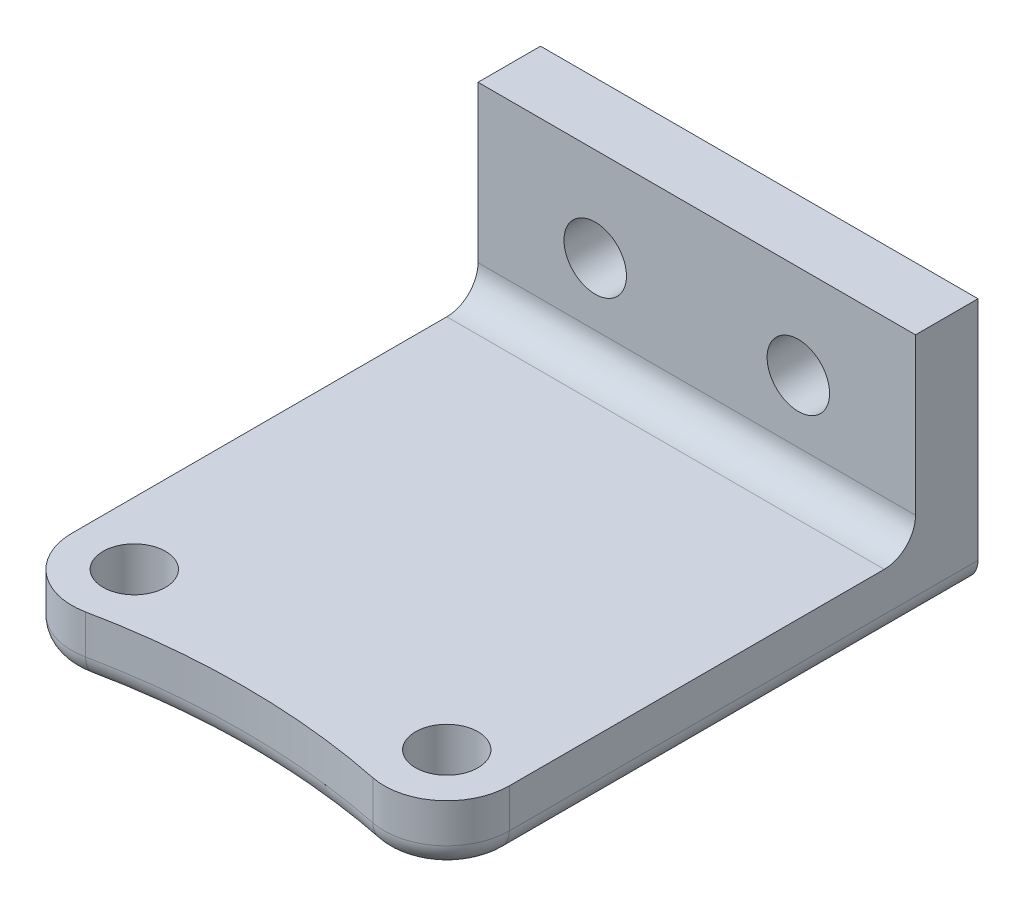
ISO-10303-21;
HEADER;
FILE_DESCRIPTION(('STEP AP214'),'2;1');
FILE_NAME('part.step','',(''),(''),'','','');
FILE_SCHEMA(('AUTOMOTIVE_DESIGN { 1 0 10303 214 1 1 1 1 }'));
ENDSEC;
DATA;
#1=APPLICATION_CONTEXT('core data for automotive mechanical design processes');
#2=APPLICATION_PROTOCOL_DEFINITION('international standard','automotive_design',2000,#1);
#3=PRODUCT_CONTEXT('',#1,'mechanical');
#4=PRODUCT('Part','Part','',(#3));
#5=PRODUCT_RELATED_PRODUCT_CATEGORY('part','',(#4));
#6=PRODUCT_DEFINITION_FORMATION('','',#4);
#7=PRODUCT_DEFINITION_CONTEXT('part definition',#1,'design');
#8=PRODUCT_DEFINITION('design','',#6,#7);
#9=PRODUCT_DEFINITION_SHAPE('','',#8);
#10=(LENGTH_UNIT() NAMED_UNIT(*) SI_UNIT(.MILLI.,.METRE.));
#11=(NAMED_UNIT(*) PLANE_ANGLE_UNIT() SI_UNIT($,.RADIAN.));
#12=(NAMED_UNIT(*) SI_UNIT($,.STERADIAN.) SOLID_ANGLE_UNIT());
#13=UNCERTAINTY_MEASURE_WITH_UNIT(LENGTH_MEASURE(1.E-05),#10,'distance_accuracy_value','');
#14=(GEOMETRIC_REPRESENTATION_CONTEXT(3) GLOBAL_UNCERTAINTY_ASSIGNED_CONTEXT((#13)) GLOBAL_UNIT_ASSIGNED_CONTEXT((#10,
#11,#12)) REPRESENTATION_CONTEXT('',''));
#15=CARTESIAN_POINT('',(0.,0.,0.));
#16=DIRECTION('',(0.,0.,1.));
#17=DIRECTION('',(1.,0.,0.));
#18=AXIS2_PLACEMENT_3D('',#15,#16,#17);
#19=CARTESIAN_POINT('',(10.,4.,48.7662963080753));
#20=DIRECTION('',(0.,1.,0.));
#21=DIRECTION('',(0.,0.,1.));
#22=AXIS2_PLACEMENT_3D('',#19,#20,#21);
#23=PLANE('',#22);
#24=DIRECTION('',(0.,0.,-1.));
#25=VECTOR('',#24,1.);
#26=CARTESIAN_POINT('',(24.,4.,-30.));
#27=LINE('',#26,#25);
#28=CARTESIAN_POINT('',(24.,4.,0.));
#29=VERTEX_POINT('',#28);
#30=CARTESIAN_POINT('',(24.,4.,-24.));
#31=VERTEX_POINT('',#30);
#32=EDGE_CURVE('E182',#29,#31,#27,.T.);
#33=ORIENTED_EDGE('',*,*,#32,.T.);
#34=DIRECTION('',(1.,0.,0.));
#35=VECTOR('',#34,1.);
#36=CARTESIAN_POINT('',(10.,4.,-24.));
#37=LINE('',#36,#35);
#38=CARTESIAN_POINT('',(-4.,4.,-24.));
#39=VERTEX_POINT('',#38);
#40=EDGE_CURVE('E56',#31,#39,#37,.F.);
#41=ORIENTED_EDGE('',*,*,#40,.T.);
#42=DIRECTION('',(0.,0.,1.));
#43=VECTOR('',#42,1.);
#44=CARTESIAN_POINT('',(-4.,4.,0.));
#45=LINE('',#44,#43);
#46=CARTESIAN_POINT('',(-4.,4.,0.));
#47=VERTEX_POINT('',#46);
#48=EDGE_CURVE('E184',#39,#47,#45,.T.);
#49=ORIENTED_EDGE('',*,*,#48,.T.);
#50=CARTESIAN_POINT('',(0.,4.,0.));
#51=DIRECTION('',(0.,1.,0.));
#52=DIRECTION('',(0.,0.,1.));
#53=AXIS2_PLACEMENT_3D('',#50,#51,#52);
#54=CIRCLE('',#53,4.);
#55=CARTESIAN_POINT('',(0.803518816065331,4.,3.91846366733558));
#56=VERTEX_POINT('',#55);
#57=EDGE_CURVE('E186',#47,#56,#54,.T.);
#58=ORIENTED_EDGE('',*,*,#57,.T.);
#59=CARTESIAN_POINT('',(10.,4.,48.7662963080753));
#60=DIRECTION('',(0.,-1.,0.));
#61=DIRECTION('',(0.,0.,1.));
#62=AXIS2_PLACEMENT_3D('',#59,#60,#61);
#63=CIRCLE('',#62,45.7810371085918);
#64=CARTESIAN_POINT('',(19.1964811839347,4.,3.91846366733558));
#65=VERTEX_POINT('',#64);
#66=EDGE_CURVE('E177',#56,#65,#63,.T.);
#67=ORIENTED_EDGE('',*,*,#66,.T.);
#68=CARTESIAN_POINT('',(20.,4.,0.));
#69=DIRECTION('',(0.,1.,0.));
#70=DIRECTION('',(0.,0.,1.));
#71=AXIS2_PLACEMENT_3D('',#68,#69,#70);
#72=CIRCLE('',#71,4.);
#73=EDGE_CURVE('E180',#65,#29,#72,.T.);
#74=ORIENTED_EDGE('',*,*,#73,.T.);
#75=EDGE_LOOP('',(#33,#41,#49,#58,#67,#74));
#76=FACE_BOUND('',#75,.T.);
#77=CARTESIAN_POINT('',(0.,4.,0.));
#78=DIRECTION('',(0.,1.,0.));
#79=DIRECTION('',(0.,0.,1.));
#80=AXIS2_PLACEMENT_3D('',#77,#78,#79);
#81=CIRCLE('',#80,2.);
#82=CARTESIAN_POINT('',(0.,4.,2.));
#83=VERTEX_POINT('',#82);
#84=EDGE_CURVE('E171',#83,#83,#81,.T.);
#85=ORIENTED_EDGE('',*,*,#84,.F.);
#86=EDGE_LOOP('',(#85));
#87=FACE_BOUND('',#86,.T.);
#88=CARTESIAN_POINT('',(20.,4.,0.));
#89=DIRECTION('',(0.,1.,0.));
#90=DIRECTION('',(0.,0.,1.));
#91=AXIS2_PLACEMENT_3D('',#88,#89,#90);
#92=CIRCLE('',#91,2.);
#93=CARTESIAN_POINT('',(20.,4.,2.));
#94=VERTEX_POINT('',#93);
#95=EDGE_CURVE('E165',#94,#94,#92,.T.);
#96=ORIENTED_EDGE('',*,*,#95,.F.);
#97=EDGE_LOOP('',(#96));
#98=FACE_BOUND('',#97,.T.);
#99=ADVANCED_FACE('F35',(#76,#87,#98),#23,.T.);
#100=CARTESIAN_POINT('',(10.,0.,48.7662963080753));
#101=DIRECTION('',(0.,1.,0.));
#102=DIRECTION('',(0.,0.,1.));
#103=AXIS2_PLACEMENT_3D('',#100,#101,#102);
#104=PLANE('',#103);
#105=DIRECTION('',(-1.,0.,0.));
#106=VECTOR('',#105,1.);
#107=CARTESIAN_POINT('',(-4.,0.,-30.));
#108=LINE('',#107,#106);
#109=CARTESIAN_POINT('',(22.5,0.,-30.));
#110=VERTEX_POINT('',#109);
#111=CARTESIAN_POINT('',(-2.5,0.,-30.));
#112=VERTEX_POINT('',#111);
#113=EDGE_CURVE('E174',#110,#112,#108,.T.);
#114=ORIENTED_EDGE('',*,*,#113,.F.);
#115=DIRECTION('',(0.,0.,-1.));
#116=VECTOR('',#115,1.);
#117=CARTESIAN_POINT('',(22.5,0.,48.7662963080753));
#118=LINE('',#117,#116);
#119=CARTESIAN_POINT('',(22.5,0.,0.));
#120=VERTEX_POINT('',#119);
#121=EDGE_CURVE('E215',#110,#120,#118,.F.);
#122=ORIENTED_EDGE('',*,*,#121,.T.);
#123=CARTESIAN_POINT('',(20.,0.,0.));
#124=DIRECTION('',(0.,1.,0.));
#125=DIRECTION('',(0.,0.,1.));
#126=AXIS2_PLACEMENT_3D('',#123,#124,#125);
#127=CIRCLE('',#126,2.5);
#128=CARTESIAN_POINT('',(19.4978007399592,0.,2.44903979208473));
#129=VERTEX_POINT('',#128);
#130=EDGE_CURVE('E213',#120,#129,#127,.F.);
#131=ORIENTED_EDGE('',*,*,#130,.T.);
#132=CARTESIAN_POINT('',(10.,0.,48.7662963080753));
#133=DIRECTION('',(0.,1.,0.));
#134=DIRECTION('',(0.,0.,1.));
#135=AXIS2_PLACEMENT_3D('',#132,#133,#134);
#136=CIRCLE('',#135,47.2810371085918);
#137=CARTESIAN_POINT('',(0.502199260040832,0.,2.44903979208473));
#138=VERTEX_POINT('',#137);
#139=EDGE_CURVE('E211',#129,#138,#136,.T.);
#140=ORIENTED_EDGE('',*,*,#139,.T.);
#141=CARTESIAN_POINT('',(0.,0.,0.));
#142=DIRECTION('',(0.,1.,0.));
#143=DIRECTION('',(0.,0.,1.));
#144=AXIS2_PLACEMENT_3D('',#141,#142,#143);
#145=CIRCLE('',#144,2.5);
#146=CARTESIAN_POINT('',(-2.5,0.,0.));
#147=VERTEX_POINT('',#146);
#148=EDGE_CURVE('E209',#138,#147,#145,.F.);
#149=ORIENTED_EDGE('',*,*,#148,.T.);
#150=DIRECTION('',(0.,0.,1.));
#151=VECTOR('',#150,1.);
#152=CARTESIAN_POINT('',(-2.5,0.,48.7662963080753));
#153=LINE('',#152,#151);
#154=EDGE_CURVE('E207',#147,#112,#153,.F.);
#155=ORIENTED_EDGE('',*,*,#154,.T.);
#156=EDGE_LOOP('',(#114,#122,#131,#140,#149,#155));
#157=FACE_BOUND('',#156,.T.);
#158=CARTESIAN_POINT('',(0.,0.,0.));
#159=DIRECTION('',(0.,1.,0.));
#160=DIRECTION('',(0.,0.,1.));
#161=AXIS2_PLACEMENT_3D('',#158,#159,#160);
#162=CIRCLE('',#161,2.);
#163=CARTESIAN_POINT('',(0.,0.,2.));
#164=VERTEX_POINT('',#163);
#165=EDGE_CURVE('E168',#164,#164,#162,.T.);
#166=ORIENTED_EDGE('',*,*,#165,.T.);
#167=EDGE_LOOP('',(#166));
#168=FACE_BOUND('',#167,.T.);
#169=CARTESIAN_POINT('',(20.,0.,0.));
#170=DIRECTION('',(0.,1.,0.));
#171=DIRECTION('',(0.,0.,1.));
#172=AXIS2_PLACEMENT_3D('',#169,#170,#171);
#173=CIRCLE('',#172,2.);
#174=CARTESIAN_POINT('',(20.,0.,2.));
#175=VERTEX_POINT('',#174);
#176=EDGE_CURVE('E164',#175,#175,#173,.T.);
#177=ORIENTED_EDGE('',*,*,#176,.T.);
#178=EDGE_LOOP('',(#177));
#179=FACE_BOUND('',#178,.T.);
#180=ADVANCED_FACE('F253',(#157,#168,#179),#104,.F.);
#181=CARTESIAN_POINT('',(10.,4.,48.7662963080753));
#182=DIRECTION('',(0.,-1.,0.));
#183=DIRECTION('',(0.,0.,-1.));
#184=AXIS2_PLACEMENT_3D('',#181,#182,#183);
#185=CYLINDRICAL_SURFACE('',#184,45.7810371085918);
#186=DIRECTION('',(0.,-1.,0.));
#187=VECTOR('',#186,1.);
#188=CARTESIAN_POINT('',(0.803518816065331,4.,3.91846366733558));
#189=LINE('',#188,#187);
#190=CARTESIAN_POINT('',(0.803518816065331,1.5,3.91846366733558));
#191=VERTEX_POINT('',#190);
#192=EDGE_CURVE('E188',#56,#191,#189,.T.);
#193=ORIENTED_EDGE('',*,*,#192,.T.);
#194=CARTESIAN_POINT('',(10.,1.5,48.7662963080753));
#195=DIRECTION('',(0.,1.,0.));
#196=DIRECTION('',(0.,0.,1.));
#197=AXIS2_PLACEMENT_3D('',#194,#195,#196);
#198=CIRCLE('',#197,45.7810371085918);
#199=CARTESIAN_POINT('',(19.1964811839347,1.5,3.91846366733558));
#200=VERTEX_POINT('',#199);
#201=EDGE_CURVE('E219',#191,#200,#198,.F.);
#202=ORIENTED_EDGE('',*,*,#201,.T.);
#203=DIRECTION('',(0.,-1.,0.));
#204=VECTOR('',#203,1.);
#205=CARTESIAN_POINT('',(19.1964811839347,4.,3.91846366733558));
#206=LINE('',#205,#204);
#207=EDGE_CURVE('E198',#65,#200,#206,.T.);
#208=ORIENTED_EDGE('',*,*,#207,.F.);
#209=ORIENTED_EDGE('',*,*,#66,.F.);
#210=EDGE_LOOP('',(#193,#202,#208,#209));
#211=FACE_BOUND('',#210,.T.);
#212=ADVANCED_FACE('F293',(#211),#185,.F.);
#213=CARTESIAN_POINT('',(20.,4.,0.));
#214=DIRECTION('',(0.,-1.,0.));
#215=DIRECTION('',(0.,0.,-1.));
#216=AXIS2_PLACEMENT_3D('',#213,#214,#215);
#217=CYLINDRICAL_SURFACE('',#216,4.);
#218=ORIENTED_EDGE('',*,*,#207,.T.);
#219=CARTESIAN_POINT('',(20.,1.5,0.));
#220=DIRECTION('',(0.,1.,0.));
#221=DIRECTION('',(0.,0.,1.));
#222=AXIS2_PLACEMENT_3D('',#219,#220,#221);
#223=CIRCLE('',#222,4.);
#224=CARTESIAN_POINT('',(24.,1.5,0.));
#225=VERTEX_POINT('',#224);
#226=EDGE_CURVE('E217',#200,#225,#223,.T.);
#227=ORIENTED_EDGE('',*,*,#226,.T.);
#228=DIRECTION('',(0.,-1.,0.));
#229=VECTOR('',#228,1.);
#230=CARTESIAN_POINT('',(24.,4.,0.));
#231=LINE('',#230,#229);
#232=EDGE_CURVE('E195',#29,#225,#231,.T.);
#233=ORIENTED_EDGE('',*,*,#232,.F.);
#234=ORIENTED_EDGE('',*,*,#73,.F.);
#235=EDGE_LOOP('',(#218,#227,#233,#234));
#236=FACE_BOUND('',#235,.T.);
#237=ADVANCED_FACE('F308',(#236),#217,.T.);
#238=CARTESIAN_POINT('',(24.,4.,-30.));
#239=DIRECTION('',(-1.,0.,0.));
#240=DIRECTION('',(0.,0.,1.));
#241=AXIS2_PLACEMENT_3D('',#238,#239,#240);
#242=PLANE('',#241);
#243=ORIENTED_EDGE('',*,*,#232,.T.);
#244=DIRECTION('',(0.,0.,-1.));
#245=VECTOR('',#244,1.);
#246=CARTESIAN_POINT('',(24.,1.5,-30.));
#247=LINE('',#246,#245);
#248=CARTESIAN_POINT('',(24.,1.5,-30.));
#249=VERTEX_POINT('',#248);
#250=EDGE_CURVE('E201',#225,#249,#247,.T.);
#251=ORIENTED_EDGE('',*,*,#250,.T.);
#252=DIRECTION('',(0.,-1.,0.));
#253=VECTOR('',#252,1.);
#254=CARTESIAN_POINT('',(24.,4.,-30.));
#255=LINE('',#254,#253);
#256=CARTESIAN_POINT('',(24.,16.,-30.));
#257=VERTEX_POINT('',#256);
#258=EDGE_CURVE('E134',#257,#249,#255,.T.);
#259=ORIENTED_EDGE('',*,*,#258,.F.);
#260=DIRECTION('',(0.,0.,-1.));
#261=VECTOR('',#260,1.);
#262=CARTESIAN_POINT('',(24.,16.,-26.));
#263=LINE('',#262,#261);
#264=CARTESIAN_POINT('',(24.,16.,-26.));
#265=VERTEX_POINT('',#264);
#266=EDGE_CURVE('E149',#265,#257,#263,.T.);
#267=ORIENTED_EDGE('',*,*,#266,.F.);
#268=DIRECTION('',(0.,-1.,0.));
#269=VECTOR('',#268,1.);
#270=CARTESIAN_POINT('',(24.,16.,-26.));
#271=LINE('',#270,#269);
#272=CARTESIAN_POINT('',(24.,6.,-26.));
#273=VERTEX_POINT('',#272);
#274=EDGE_CURVE('E161',#265,#273,#271,.T.);
#275=ORIENTED_EDGE('',*,*,#274,.T.);
#276=CARTESIAN_POINT('',(24.,6.,-24.));
#277=DIRECTION('',(-1.,0.,0.));
#278=DIRECTION('',(0.,0.,1.));
#279=AXIS2_PLACEMENT_3D('',#276,#277,#278);
#280=CIRCLE('',#279,2.);
#281=EDGE_CURVE('E43',#273,#31,#280,.T.);
#282=ORIENTED_EDGE('',*,*,#281,.T.);
#283=ORIENTED_EDGE('',*,*,#32,.F.);
#284=EDGE_LOOP('',(#243,#251,#259,#267,#275,#282,#283));
#285=FACE_BOUND('',#284,.T.);
#286=ADVANCED_FACE('F247',(#285),#242,.F.);
#287=CARTESIAN_POINT('',(-4.,4.,-30.));
#288=DIRECTION('',(0.,0.,1.));
#289=DIRECTION('',(1.,0.,0.));
#290=AXIS2_PLACEMENT_3D('',#287,#288,#289);
#291=PLANE('',#290);
#292=CARTESIAN_POINT('',(3.5,10.,-30.));
#293=DIRECTION('',(0.,0.,1.));
#294=DIRECTION('',(1.,0.,0.));
#295=AXIS2_PLACEMENT_3D('',#292,#293,#294);
#296=CIRCLE('',#295,2.);
#297=CARTESIAN_POINT('',(5.5,10.,-30.));
#298=VERTEX_POINT('',#297);
#299=EDGE_CURVE('E150',#298,#298,#296,.F.);
#300=ORIENTED_EDGE('',*,*,#299,.F.);
#301=EDGE_LOOP('',(#300));
#302=FACE_BOUND('',#301,.T.);
#303=CARTESIAN_POINT('',(16.5,10.,-30.));
#304=DIRECTION('',(0.,0.,1.));
#305=DIRECTION('',(1.,0.,0.));
#306=AXIS2_PLACEMENT_3D('',#303,#304,#305);
#307=CIRCLE('',#306,2.);
#308=CARTESIAN_POINT('',(18.5,10.,-30.));
#309=VERTEX_POINT('',#308);
#310=EDGE_CURVE('E156',#309,#309,#307,.F.);
#311=ORIENTED_EDGE('',*,*,#310,.F.);
#312=EDGE_LOOP('',(#311));
#313=FACE_BOUND('',#312,.T.);
#314=ORIENTED_EDGE('',*,*,#258,.T.);
#315=CARTESIAN_POINT('',(22.5,1.5,-30.));
#316=DIRECTION('',(0.,0.,1.));
#317=DIRECTION('',(1.,0.,0.));
#318=AXIS2_PLACEMENT_3D('',#315,#316,#317);
#319=CIRCLE('',#318,1.5);
#320=EDGE_CURVE('E205',#249,#110,#319,.F.);
#321=ORIENTED_EDGE('',*,*,#320,.T.);
#322=ORIENTED_EDGE('',*,*,#113,.T.);
#323=CARTESIAN_POINT('',(-2.5,1.5,-30.));
#324=DIRECTION('',(0.,0.,1.));
#325=DIRECTION('',(1.,0.,0.));
#326=AXIS2_PLACEMENT_3D('',#323,#324,#325);
#327=CIRCLE('',#326,1.5);
#328=CARTESIAN_POINT('',(-4.,1.5,-30.));
#329=VERTEX_POINT('',#328);
#330=EDGE_CURVE('E131',#112,#329,#327,.F.);
#331=ORIENTED_EDGE('',*,*,#330,.T.);
#332=DIRECTION('',(0.,-1.,0.));
#333=VECTOR('',#332,1.);
#334=CARTESIAN_POINT('',(-4.,4.,-30.));
#335=LINE('',#334,#333);
#336=CARTESIAN_POINT('',(-4.,16.,-30.));
#337=VERTEX_POINT('',#336);
#338=EDGE_CURVE('E123',#337,#329,#335,.T.);
#339=ORIENTED_EDGE('',*,*,#338,.F.);
#340=DIRECTION('',(-1.,0.,0.));
#341=VECTOR('',#340,1.);
#342=CARTESIAN_POINT('',(24.,16.,-30.));
#343=LINE('',#342,#341);
#344=EDGE_CURVE('E128',#257,#337,#343,.T.);
#345=ORIENTED_EDGE('',*,*,#344,.F.);
#346=EDGE_LOOP('',(#314,#321,#322,#331,#339,#345));
#347=FACE_BOUND('',#346,.T.);
#348=ADVANCED_FACE('F126',(#302,#313,#347),#291,.F.);
#349=CARTESIAN_POINT('',(-4.,4.,0.));
#350=DIRECTION('',(1.,0.,0.));
#351=DIRECTION('',(0.,0.,-1.));
#352=AXIS2_PLACEMENT_3D('',#349,#350,#351);
#353=PLANE('',#352);
#354=ORIENTED_EDGE('',*,*,#338,.T.);
#355=DIRECTION('',(0.,0.,1.));
#356=VECTOR('',#355,1.);
#357=CARTESIAN_POINT('',(-4.,1.5,0.));
#358=LINE('',#357,#356);
#359=CARTESIAN_POINT('',(-4.,1.5,0.));
#360=VERTEX_POINT('',#359);
#361=EDGE_CURVE('E223',#329,#360,#358,.T.);
#362=ORIENTED_EDGE('',*,*,#361,.T.);
#363=DIRECTION('',(0.,-1.,0.));
#364=VECTOR('',#363,1.);
#365=CARTESIAN_POINT('',(-4.,4.,0.));
#366=LINE('',#365,#364);
#367=EDGE_CURVE('E135',#47,#360,#366,.T.);
#368=ORIENTED_EDGE('',*,*,#367,.F.);
#369=ORIENTED_EDGE('',*,*,#48,.F.);
#370=CARTESIAN_POINT('',(-4.,6.,-24.));
#371=DIRECTION('',(1.,0.,0.));
#372=DIRECTION('',(0.,0.,-1.));
#373=AXIS2_PLACEMENT_3D('',#370,#371,#372);
#374=CIRCLE('',#373,2.);
#375=CARTESIAN_POINT('',(-4.,6.,-26.));
#376=VERTEX_POINT('',#375);
#377=EDGE_CURVE('E11',#39,#376,#374,.T.);
#378=ORIENTED_EDGE('',*,*,#377,.T.);
#379=DIRECTION('',(0.,-1.,0.));
#380=VECTOR('',#379,1.);
#381=CARTESIAN_POINT('',(-4.,16.,-26.));
#382=LINE('',#381,#380);
#383=CARTESIAN_POINT('',(-4.,16.,-26.));
#384=VERTEX_POINT('',#383);
#385=EDGE_CURVE('E141',#384,#376,#382,.T.);
#386=ORIENTED_EDGE('',*,*,#385,.F.);
#387=DIRECTION('',(0.,0.,1.));
#388=VECTOR('',#387,1.);
#389=CARTESIAN_POINT('',(-4.,16.,-30.));
#390=LINE('',#389,#388);
#391=EDGE_CURVE('E138',#337,#384,#390,.T.);
#392=ORIENTED_EDGE('',*,*,#391,.F.);
#393=EDGE_LOOP('',(#354,#362,#368,#369,#378,#386,#392));
#394=FACE_BOUND('',#393,.T.);
#395=ADVANCED_FACE('F139',(#394),#353,.F.);
#396=CARTESIAN_POINT('',(0.,4.,0.));
#397=DIRECTION('',(0.,-1.,0.));
#398=DIRECTION('',(0.,0.,-1.));
#399=AXIS2_PLACEMENT_3D('',#396,#397,#398);
#400=CYLINDRICAL_SURFACE('',#399,4.);
#401=ORIENTED_EDGE('',*,*,#367,.T.);
#402=CARTESIAN_POINT('',(0.,1.5,0.));
#403=DIRECTION('',(0.,1.,0.));
#404=DIRECTION('',(0.,0.,1.));
#405=AXIS2_PLACEMENT_3D('',#402,#403,#404);
#406=CIRCLE('',#405,4.);
#407=EDGE_CURVE('E221',#360,#191,#406,.T.);
#408=ORIENTED_EDGE('',*,*,#407,.T.);
#409=ORIENTED_EDGE('',*,*,#192,.F.);
#410=ORIENTED_EDGE('',*,*,#57,.F.);
#411=EDGE_LOOP('',(#401,#408,#409,#410));
#412=FACE_BOUND('',#411,.T.);
#413=ADVANCED_FACE('F278',(#412),#400,.T.);
#414=CARTESIAN_POINT('',(0.,4.,0.));
#415=DIRECTION('',(0.,-1.,0.));
#416=DIRECTION('',(0.,0.,-1.));
#417=AXIS2_PLACEMENT_3D('',#414,#415,#416);
#418=CYLINDRICAL_SURFACE('',#417,2.);
#419=ORIENTED_EDGE('',*,*,#84,.T.);
#420=EDGE_LOOP('',(#419));
#421=FACE_BOUND('',#420,.T.);
#422=ORIENTED_EDGE('',*,*,#165,.F.);
#423=EDGE_LOOP('',(#422));
#424=FACE_BOUND('',#423,.T.);
#425=ADVANCED_FACE('F296',(#421,#424),#418,.F.);
#426=CARTESIAN_POINT('',(20.,4.,0.));
#427=DIRECTION('',(0.,-1.,0.));
#428=DIRECTION('',(0.,0.,-1.));
#429=AXIS2_PLACEMENT_3D('',#426,#427,#428);
#430=CYLINDRICAL_SURFACE('',#429,2.);
#431=ORIENTED_EDGE('',*,*,#95,.T.);
#432=EDGE_LOOP('',(#431));
#433=FACE_BOUND('',#432,.T.);
#434=ORIENTED_EDGE('',*,*,#176,.F.);
#435=EDGE_LOOP('',(#434));
#436=FACE_BOUND('',#435,.T.);
#437=ADVANCED_FACE('F338',(#433,#436),#430,.F.);
#438=CARTESIAN_POINT('',(-4.,16.,-26.));
#439=DIRECTION('',(0.,0.,-1.));
#440=DIRECTION('',(-1.,0.,0.));
#441=AXIS2_PLACEMENT_3D('',#438,#439,#440);
#442=PLANE('',#441);
#443=CARTESIAN_POINT('',(3.5,10.,-26.));
#444=DIRECTION('',(0.,0.,1.));
#445=DIRECTION('',(1.,0.,0.));
#446=AXIS2_PLACEMENT_3D('',#443,#444,#445);
#447=CIRCLE('',#446,2.);
#448=CARTESIAN_POINT('',(5.5,10.,-26.));
#449=VERTEX_POINT('',#448);
#450=EDGE_CURVE('E153',#449,#449,#447,.T.);
#451=ORIENTED_EDGE('',*,*,#450,.F.);
#452=EDGE_LOOP('',(#451));
#453=FACE_BOUND('',#452,.T.);
#454=CARTESIAN_POINT('',(16.5,10.,-26.));
#455=DIRECTION('',(0.,0.,1.));
#456=DIRECTION('',(1.,0.,0.));
#457=AXIS2_PLACEMENT_3D('',#454,#455,#456);
#458=CIRCLE('',#457,2.);
#459=CARTESIAN_POINT('',(18.5,10.,-26.));
#460=VERTEX_POINT('',#459);
#461=EDGE_CURVE('E238',#460,#460,#458,.T.);
#462=ORIENTED_EDGE('',*,*,#461,.F.);
#463=EDGE_LOOP('',(#462));
#464=FACE_BOUND('',#463,.T.);
#465=ORIENTED_EDGE('',*,*,#385,.T.);
#466=DIRECTION('',(1.,0.,0.));
#467=VECTOR('',#466,1.);
#468=CARTESIAN_POINT('',(-4.,6.,-26.));
#469=LINE('',#468,#467);
#470=EDGE_CURVE('E225',#376,#273,#469,.T.);
#471=ORIENTED_EDGE('',*,*,#470,.T.);
#472=ORIENTED_EDGE('',*,*,#274,.F.);
#473=DIRECTION('',(1.,0.,0.));
#474=VECTOR('',#473,1.);
#475=CARTESIAN_POINT('',(-4.,16.,-26.));
#476=LINE('',#475,#474);
#477=EDGE_CURVE('E144',#384,#265,#476,.T.);
#478=ORIENTED_EDGE('',*,*,#477,.F.);
#479=EDGE_LOOP('',(#465,#471,#472,#478));
#480=FACE_BOUND('',#479,.T.);
#481=ADVANCED_FACE('F244',(#453,#464,#480),#442,.F.);
#482=CARTESIAN_POINT('',(0.,16.,0.));
#483=DIRECTION('',(0.,1.,0.));
#484=DIRECTION('',(0.,0.,1.));
#485=AXIS2_PLACEMENT_3D('',#482,#483,#484);
#486=PLANE('',#485);
#487=ORIENTED_EDGE('',*,*,#344,.T.);
#488=ORIENTED_EDGE('',*,*,#391,.T.);
#489=ORIENTED_EDGE('',*,*,#477,.T.);
#490=ORIENTED_EDGE('',*,*,#266,.T.);
#491=EDGE_LOOP('',(#487,#488,#489,#490));
#492=FACE_BOUND('',#491,.T.);
#493=ADVANCED_FACE('F147',(#492),#486,.T.);
#494=CARTESIAN_POINT('',(16.5,10.,-35.6568542494924));
#495=DIRECTION('',(0.,0.,1.));
#496=DIRECTION('',(1.,0.,0.));
#497=AXIS2_PLACEMENT_3D('',#494,#495,#496);
#498=CYLINDRICAL_SURFACE('',#497,2.);
#499=ORIENTED_EDGE('',*,*,#310,.T.);
#500=EDGE_LOOP('',(#499));
#501=FACE_BOUND('',#500,.T.);
#502=ORIENTED_EDGE('',*,*,#461,.T.);
#503=EDGE_LOOP('',(#502));
#504=FACE_BOUND('',#503,.T.);
#505=ADVANCED_FACE('F325',(#501,#504),#498,.F.);
#506=CARTESIAN_POINT('',(3.5,10.,-35.6568542494924));
#507=DIRECTION('',(0.,0.,1.));
#508=DIRECTION('',(1.,0.,0.));
#509=AXIS2_PLACEMENT_3D('',#506,#507,#508);
#510=CYLINDRICAL_SURFACE('',#509,2.);
#511=ORIENTED_EDGE('',*,*,#299,.T.);
#512=EDGE_LOOP('',(#511));
#513=FACE_BOUND('',#512,.T.);
#514=ORIENTED_EDGE('',*,*,#450,.T.);
#515=EDGE_LOOP('',(#514));
#516=FACE_BOUND('',#515,.T.);
#517=ADVANCED_FACE('F321',(#513,#516),#510,.F.);
#518=CARTESIAN_POINT('',(-2.5,1.5,0.));
#519=DIRECTION('',(0.,0.,1.));
#520=DIRECTION('',(1.,0.,0.));
#521=AXIS2_PLACEMENT_3D('',#518,#519,#520);
#522=CYLINDRICAL_SURFACE('',#521,1.5);
#523=ORIENTED_EDGE('',*,*,#330,.F.);
#524=ORIENTED_EDGE('',*,*,#154,.F.);
#525=CARTESIAN_POINT('',(-2.5,1.5,0.));
#526=DIRECTION('',(0.,0.,1.));
#527=DIRECTION('',(0.,-1.,0.));
#528=AXIS2_PLACEMENT_3D('',#525,#526,#527);
#529=CIRCLE('',#528,1.5);
#530=EDGE_CURVE('E235',#360,#147,#529,.T.);
#531=ORIENTED_EDGE('',*,*,#530,.F.);
#532=ORIENTED_EDGE('',*,*,#361,.F.);
#533=EDGE_LOOP('',(#523,#524,#531,#532));
#534=FACE_BOUND('',#533,.T.);
#535=ADVANCED_FACE('F274',(#534),#522,.T.);
#536=CARTESIAN_POINT('',(0.,1.5,0.));
#537=DIRECTION('',(0.,1.,0.));
#538=DIRECTION('',(0.,0.,1.));
#539=AXIS2_PLACEMENT_3D('',#536,#537,#538);
#540=TOROIDAL_SURFACE('',#539,2.5,1.5);
#541=ORIENTED_EDGE('',*,*,#530,.T.);
#542=ORIENTED_EDGE('',*,*,#148,.F.);
#543=CARTESIAN_POINT('',(0.502199260040832,1.5,2.44903979208473));
#544=DIRECTION('',(0.979615916833894,0.,-0.200879704016333));
#545=DIRECTION('',(-0.200879704016333,0.,-0.979615916833894));
#546=AXIS2_PLACEMENT_3D('',#543,#544,#545);
#547=CIRCLE('',#546,1.5);
#548=EDGE_CURVE('E232',#191,#138,#547,.T.);
#549=ORIENTED_EDGE('',*,*,#548,.F.);
#550=ORIENTED_EDGE('',*,*,#407,.F.);
#551=EDGE_LOOP('',(#541,#542,#549,#550));
#552=FACE_BOUND('',#551,.T.);
#553=ADVANCED_FACE('F271',(#552),#540,.T.);
#554=CARTESIAN_POINT('',(10.,1.5,48.7662963080753));
#555=DIRECTION('',(0.,1.,0.));
#556=DIRECTION('',(0.,0.,1.));
#557=AXIS2_PLACEMENT_3D('',#554,#555,#556);
#558=TOROIDAL_SURFACE('',#557,47.2810371085918,1.5);
#559=ORIENTED_EDGE('',*,*,#548,.T.);
#560=ORIENTED_EDGE('',*,*,#139,.F.);
#561=CARTESIAN_POINT('',(19.4978007399592,1.5,2.44903979208473));
#562=DIRECTION('',(0.979615916833894,0.,0.200879704016332));
#563=DIRECTION('',(0.200879704016332,0.,-0.979615916833894));
#564=AXIS2_PLACEMENT_3D('',#561,#562,#563);
#565=CIRCLE('',#564,1.5);
#566=EDGE_CURVE('E229',#200,#129,#565,.T.);
#567=ORIENTED_EDGE('',*,*,#566,.F.);
#568=ORIENTED_EDGE('',*,*,#201,.F.);
#569=EDGE_LOOP('',(#559,#560,#567,#568));
#570=FACE_BOUND('',#569,.T.);
#571=ADVANCED_FACE('F266',(#570),#558,.T.);
#572=CARTESIAN_POINT('',(20.,1.5,0.));
#573=DIRECTION('',(0.,1.,0.));
#574=DIRECTION('',(0.,0.,1.));
#575=AXIS2_PLACEMENT_3D('',#572,#573,#574);
#576=TOROIDAL_SURFACE('',#575,2.5,1.5);
#577=ORIENTED_EDGE('',*,*,#566,.T.);
#578=ORIENTED_EDGE('',*,*,#130,.F.);
#579=CARTESIAN_POINT('',(22.5,1.5,0.));
#580=DIRECTION('',(0.,0.,-1.));
#581=DIRECTION('',(-1.,0.,0.));
#582=AXIS2_PLACEMENT_3D('',#579,#580,#581);
#583=CIRCLE('',#582,1.5);
#584=EDGE_CURVE('E226',#225,#120,#583,.T.);
#585=ORIENTED_EDGE('',*,*,#584,.F.);
#586=ORIENTED_EDGE('',*,*,#226,.F.);
#587=EDGE_LOOP('',(#577,#578,#585,#586));
#588=FACE_BOUND('',#587,.T.);
#589=ADVANCED_FACE('F261',(#588),#576,.T.);
#590=CARTESIAN_POINT('',(22.5,1.5,-30.));
#591=DIRECTION('',(0.,0.,-1.));
#592=DIRECTION('',(-1.,0.,0.));
#593=AXIS2_PLACEMENT_3D('',#590,#591,#592);
#594=CYLINDRICAL_SURFACE('',#593,1.5);
#595=ORIENTED_EDGE('',*,*,#584,.T.);
#596=ORIENTED_EDGE('',*,*,#121,.F.);
#597=ORIENTED_EDGE('',*,*,#320,.F.);
#598=ORIENTED_EDGE('',*,*,#250,.F.);
#599=EDGE_LOOP('',(#595,#596,#597,#598));
#600=FACE_BOUND('',#599,.T.);
#601=ADVANCED_FACE('F257',(#600),#594,.T.);
#602=CARTESIAN_POINT('',(-4.,6.,-24.));
#603=DIRECTION('',(1.,0.,0.));
#604=DIRECTION('',(0.,0.,-1.));
#605=AXIS2_PLACEMENT_3D('',#602,#603,#604);
#606=CYLINDRICAL_SURFACE('',#605,2.);
#607=ORIENTED_EDGE('',*,*,#377,.F.);
#608=ORIENTED_EDGE('',*,*,#40,.F.);
#609=ORIENTED_EDGE('',*,*,#281,.F.);
#610=ORIENTED_EDGE('',*,*,#470,.F.);
#611=EDGE_LOOP('',(#607,#608,#609,#610));
#612=FACE_BOUND('',#611,.T.);
#613=ADVANCED_FACE('F37',(#612),#606,.F.);
#614=CLOSED_SHELL('',(#99,#180,#212,#237,#286,#348,#395,#413,#425,#437,#481,#493,#505,#517,#535,
#553,#571,#589,#601,#613));
#615=MANIFOLD_SOLID_BREP('B2',#614);
#616=ADVANCED_BREP_SHAPE_REPRESENTATION('',(#18,#615),#14);
#617=SHAPE_DEFINITION_REPRESENTATION(#9,#616);
ENDSEC;
END-ISO-10303-21;
